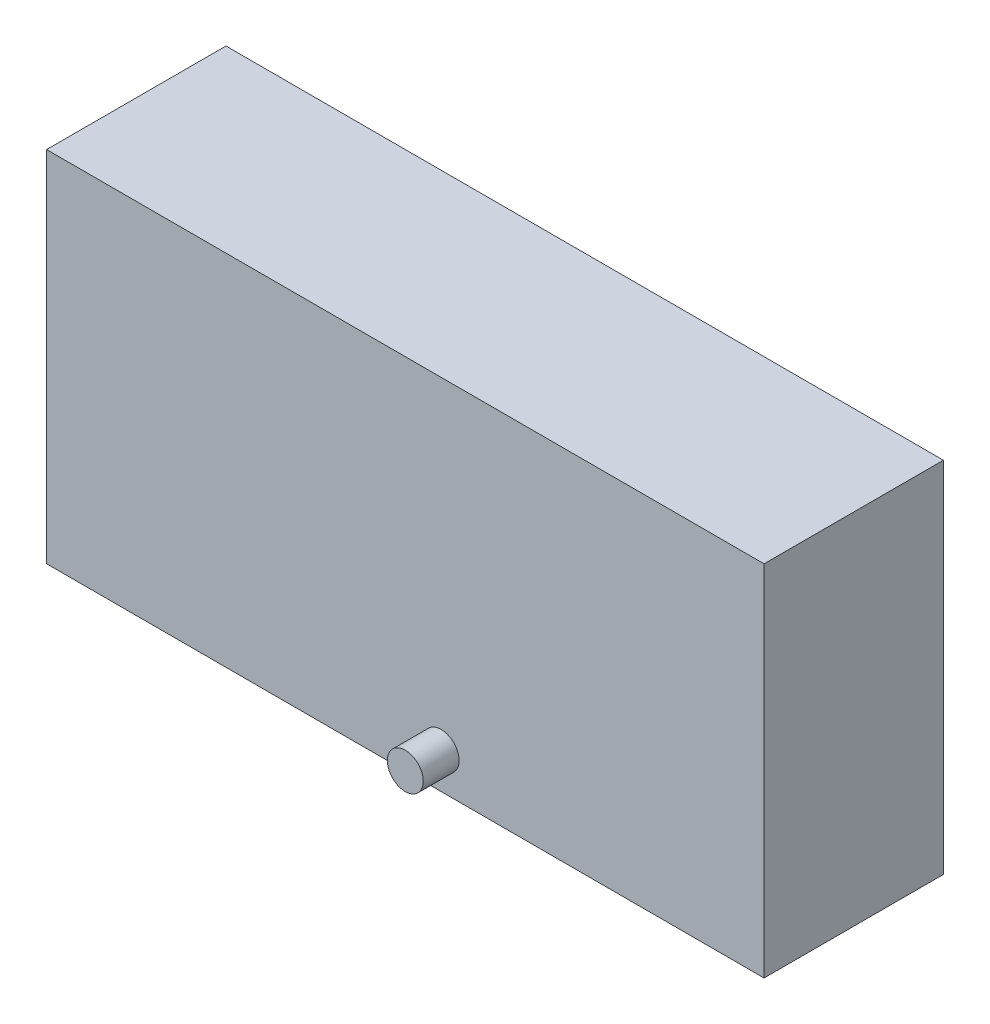
ISO-10303-21;
HEADER;
FILE_DESCRIPTION(('STEP AP214'),'2;1');
FILE_NAME('part.step','',(''),(''),'','','');
FILE_SCHEMA(('AUTOMOTIVE_DESIGN { 1 0 10303 214 1 1 1 1 }'));
ENDSEC;
DATA;
#1=APPLICATION_CONTEXT('core data for automotive mechanical design processes');
#2=APPLICATION_PROTOCOL_DEFINITION('international standard','automotive_design',2000,#1);
#3=PRODUCT_CONTEXT('',#1,'mechanical');
#4=PRODUCT('Part','Part','',(#3));
#5=PRODUCT_RELATED_PRODUCT_CATEGORY('part','',(#4));
#6=PRODUCT_DEFINITION_FORMATION('','',#4);
#7=PRODUCT_DEFINITION_CONTEXT('part definition',#1,'design');
#8=PRODUCT_DEFINITION('design','',#6,#7);
#9=PRODUCT_DEFINITION_SHAPE('','',#8);
#10=(LENGTH_UNIT() NAMED_UNIT(*) SI_UNIT(.MILLI.,.METRE.));
#11=(NAMED_UNIT(*) PLANE_ANGLE_UNIT() SI_UNIT($,.RADIAN.));
#12=(NAMED_UNIT(*) SI_UNIT($,.STERADIAN.) SOLID_ANGLE_UNIT());
#13=UNCERTAINTY_MEASURE_WITH_UNIT(LENGTH_MEASURE(1.E-05),#10,'distance_accuracy_value','');
#14=(GEOMETRIC_REPRESENTATION_CONTEXT(3) GLOBAL_UNCERTAINTY_ASSIGNED_CONTEXT((#13)) GLOBAL_UNIT_ASSIGNED_CONTEXT((#10,
#11,#12)) REPRESENTATION_CONTEXT('',''));
#15=CARTESIAN_POINT('',(0.,0.,0.));
#16=DIRECTION('',(0.,0.,1.));
#17=DIRECTION('',(1.,0.,0.));
#18=AXIS2_PLACEMENT_3D('',#15,#16,#17);
#19=CARTESIAN_POINT('',(0.,0.,10.));
#20=DIRECTION('',(0.,1.,0.));
#21=DIRECTION('',(0.,0.,1.));
#22=AXIS2_PLACEMENT_3D('',#19,#20,#21);
#23=PLANE('',#22);
#24=DIRECTION('',(1.,0.,0.));
#25=VECTOR('',#24,1.);
#26=CARTESIAN_POINT('',(0.,0.,0.));
#27=LINE('',#26,#25);
#28=CARTESIAN_POINT('',(-20.,0.,0.));
#29=VERTEX_POINT('',#28);
#30=CARTESIAN_POINT('',(20.,0.,0.));
#31=VERTEX_POINT('',#30);
#32=EDGE_CURVE('E72',#29,#31,#27,.T.);
#33=ORIENTED_EDGE('',*,*,#32,.T.);
#34=DIRECTION('',(0.,0.,-1.));
#35=VECTOR('',#34,1.);
#36=CARTESIAN_POINT('',(20.,0.,10.));
#37=LINE('',#36,#35);
#38=CARTESIAN_POINT('',(20.,0.,10.));
#39=VERTEX_POINT('',#38);
#40=EDGE_CURVE('E46',#39,#31,#37,.T.);
#41=ORIENTED_EDGE('',*,*,#40,.F.);
#42=DIRECTION('',(1.,0.,0.));
#43=VECTOR('',#42,1.);
#44=CARTESIAN_POINT('',(0.,0.,10.));
#45=LINE('',#44,#43);
#46=CARTESIAN_POINT('',(-20.,0.,10.));
#47=VERTEX_POINT('',#46);
#48=EDGE_CURVE('E77',#47,#39,#45,.T.);
#49=ORIENTED_EDGE('',*,*,#48,.F.);
#50=DIRECTION('',(0.,0.,-1.));
#51=VECTOR('',#50,1.);
#52=CARTESIAN_POINT('',(-20.,0.,10.));
#53=LINE('',#52,#51);
#54=EDGE_CURVE('E94',#47,#29,#53,.T.);
#55=ORIENTED_EDGE('',*,*,#54,.T.);
#56=EDGE_LOOP('',(#33,#41,#49,#55));
#57=FACE_BOUND('',#56,.T.);
#58=ADVANCED_FACE('F43',(#57),#23,.F.);
#59=CARTESIAN_POINT('',(20.,0.,10.));
#60=DIRECTION('',(-1.,0.,0.));
#61=DIRECTION('',(0.,0.,1.));
#62=AXIS2_PLACEMENT_3D('',#59,#60,#61);
#63=PLANE('',#62);
#64=DIRECTION('',(0.,1.,0.));
#65=VECTOR('',#64,1.);
#66=CARTESIAN_POINT('',(20.,0.,0.));
#67=LINE('',#66,#65);
#68=CARTESIAN_POINT('',(20.,20.,0.));
#69=VERTEX_POINT('',#68);
#70=EDGE_CURVE('E93',#31,#69,#67,.T.);
#71=ORIENTED_EDGE('',*,*,#70,.T.);
#72=DIRECTION('',(0.,0.,-1.));
#73=VECTOR('',#72,1.);
#74=CARTESIAN_POINT('',(20.,20.,10.));
#75=LINE('',#74,#73);
#76=CARTESIAN_POINT('',(20.,20.,10.));
#77=VERTEX_POINT('',#76);
#78=EDGE_CURVE('E111',#77,#69,#75,.T.);
#79=ORIENTED_EDGE('',*,*,#78,.F.);
#80=DIRECTION('',(0.,1.,0.));
#81=VECTOR('',#80,1.);
#82=CARTESIAN_POINT('',(20.,0.,10.));
#83=LINE('',#82,#81);
#84=EDGE_CURVE('E58',#39,#77,#83,.T.);
#85=ORIENTED_EDGE('',*,*,#84,.F.);
#86=ORIENTED_EDGE('',*,*,#40,.T.);
#87=EDGE_LOOP('',(#71,#79,#85,#86));
#88=FACE_BOUND('',#87,.T.);
#89=ADVANCED_FACE('F122',(#88),#63,.F.);
#90=CARTESIAN_POINT('',(0.,20.,10.));
#91=DIRECTION('',(0.,-1.,0.));
#92=DIRECTION('',(0.,0.,-1.));
#93=AXIS2_PLACEMENT_3D('',#90,#91,#92);
#94=PLANE('',#93);
#95=DIRECTION('',(-1.,0.,0.));
#96=VECTOR('',#95,1.);
#97=CARTESIAN_POINT('',(0.,20.,0.));
#98=LINE('',#97,#96);
#99=CARTESIAN_POINT('',(-20.,20.,0.));
#100=VERTEX_POINT('',#99);
#101=EDGE_CURVE('E112',#69,#100,#98,.T.);
#102=ORIENTED_EDGE('',*,*,#101,.T.);
#103=DIRECTION('',(0.,0.,-1.));
#104=VECTOR('',#103,1.);
#105=CARTESIAN_POINT('',(-20.,20.,10.));
#106=LINE('',#105,#104);
#107=CARTESIAN_POINT('',(-20.,20.,10.));
#108=VERTEX_POINT('',#107);
#109=EDGE_CURVE('E98',#108,#100,#106,.T.);
#110=ORIENTED_EDGE('',*,*,#109,.F.);
#111=DIRECTION('',(-1.,0.,0.));
#112=VECTOR('',#111,1.);
#113=CARTESIAN_POINT('',(0.,20.,10.));
#114=LINE('',#113,#112);
#115=EDGE_CURVE('E114',#77,#108,#114,.T.);
#116=ORIENTED_EDGE('',*,*,#115,.F.);
#117=ORIENTED_EDGE('',*,*,#78,.T.);
#118=EDGE_LOOP('',(#102,#110,#116,#117));
#119=FACE_BOUND('',#118,.T.);
#120=ADVANCED_FACE('F125',(#119),#94,.F.);
#121=CARTESIAN_POINT('',(0.,0.,10.));
#122=DIRECTION('',(0.,0.,-1.));
#123=DIRECTION('',(-1.,0.,0.));
#124=AXIS2_PLACEMENT_3D('',#121,#122,#123);
#125=PLANE('',#124);
#126=CARTESIAN_POINT('',(2.,2.,10.));
#127=DIRECTION('',(0.,0.,1.));
#128=DIRECTION('',(1.,0.,0.));
#129=AXIS2_PLACEMENT_3D('',#126,#127,#128);
#130=CIRCLE('',#129,1.);
#131=CARTESIAN_POINT('',(3.,2.,10.));
#132=VERTEX_POINT('',#131);
#133=EDGE_CURVE('E11',#132,#132,#130,.T.);
#134=ORIENTED_EDGE('',*,*,#133,.F.);
#135=EDGE_LOOP('',(#134));
#136=FACE_BOUND('',#135,.T.);
#137=ORIENTED_EDGE('',*,*,#115,.T.);
#138=DIRECTION('',(0.,1.,0.));
#139=VECTOR('',#138,1.);
#140=CARTESIAN_POINT('',(-20.,0.,10.));
#141=LINE('',#140,#139);
#142=EDGE_CURVE('E97',#47,#108,#141,.T.);
#143=ORIENTED_EDGE('',*,*,#142,.F.);
#144=ORIENTED_EDGE('',*,*,#48,.T.);
#145=ORIENTED_EDGE('',*,*,#84,.T.);
#146=EDGE_LOOP('',(#137,#143,#144,#145));
#147=FACE_BOUND('',#146,.T.);
#148=ADVANCED_FACE('F124',(#136,#147),#125,.F.);
#149=CARTESIAN_POINT('',(0.,0.,0.));
#150=DIRECTION('',(0.,0.,-1.));
#151=DIRECTION('',(-1.,0.,0.));
#152=AXIS2_PLACEMENT_3D('',#149,#150,#151);
#153=PLANE('',#152);
#154=ORIENTED_EDGE('',*,*,#32,.F.);
#155=DIRECTION('',(0.,1.,0.));
#156=VECTOR('',#155,1.);
#157=CARTESIAN_POINT('',(-20.,0.,0.));
#158=LINE('',#157,#156);
#159=EDGE_CURVE('E89',#29,#100,#158,.T.);
#160=ORIENTED_EDGE('',*,*,#159,.T.);
#161=ORIENTED_EDGE('',*,*,#101,.F.);
#162=ORIENTED_EDGE('',*,*,#70,.F.);
#163=EDGE_LOOP('',(#154,#160,#161,#162));
#164=FACE_BOUND('',#163,.T.);
#165=ADVANCED_FACE('F87',(#164),#153,.T.);
#166=CARTESIAN_POINT('',(2.,2.,12.));
#167=DIRECTION('',(0.,0.,-1.));
#168=DIRECTION('',(-1.,0.,0.));
#169=AXIS2_PLACEMENT_3D('',#166,#167,#168);
#170=CYLINDRICAL_SURFACE('',#169,1.);
#171=CARTESIAN_POINT('',(2.,2.,12.));
#172=DIRECTION('',(0.,0.,1.));
#173=DIRECTION('',(1.,0.,0.));
#174=AXIS2_PLACEMENT_3D('',#171,#172,#173);
#175=CIRCLE('',#174,1.);
#176=CARTESIAN_POINT('',(3.,2.,12.));
#177=VERTEX_POINT('',#176);
#178=EDGE_CURVE('E95',#177,#177,#175,.T.);
#179=ORIENTED_EDGE('',*,*,#178,.F.);
#180=EDGE_LOOP('',(#179));
#181=FACE_BOUND('',#180,.T.);
#182=ORIENTED_EDGE('',*,*,#133,.T.);
#183=EDGE_LOOP('',(#182));
#184=FACE_BOUND('',#183,.T.);
#185=ADVANCED_FACE('F131',(#181,#184),#170,.T.);
#186=CARTESIAN_POINT('',(2.,2.,12.));
#187=DIRECTION('',(0.,0.,1.));
#188=DIRECTION('',(1.,0.,0.));
#189=AXIS2_PLACEMENT_3D('',#186,#187,#188);
#190=PLANE('',#189);
#191=ORIENTED_EDGE('',*,*,#178,.T.);
#192=EDGE_LOOP('',(#191));
#193=FACE_BOUND('',#192,.T.);
#194=ADVANCED_FACE('F151',(#193),#190,.T.);
#195=CARTESIAN_POINT('',(-20.,0.,10.));
#196=DIRECTION('',(-1.,0.,0.));
#197=DIRECTION('',(0.,0.,1.));
#198=AXIS2_PLACEMENT_3D('',#195,#196,#197);
#199=PLANE('',#198);
#200=ORIENTED_EDGE('',*,*,#159,.F.);
#201=ORIENTED_EDGE('',*,*,#54,.F.);
#202=ORIENTED_EDGE('',*,*,#142,.T.);
#203=ORIENTED_EDGE('',*,*,#109,.T.);
#204=EDGE_LOOP('',(#200,#201,#202,#203));
#205=FACE_BOUND('',#204,.T.);
#206=ADVANCED_FACE('F105',(#205),#199,.T.);
#207=CLOSED_SHELL('',(#58,#89,#120,#148,#165,#185,#194,#206));
#208=MANIFOLD_SOLID_BREP('B2',#207);
#209=ADVANCED_BREP_SHAPE_REPRESENTATION('',(#18,#208),#14);
#210=SHAPE_DEFINITION_REPRESENTATION(#9,#209);
ENDSEC;
END-ISO-10303-21;
